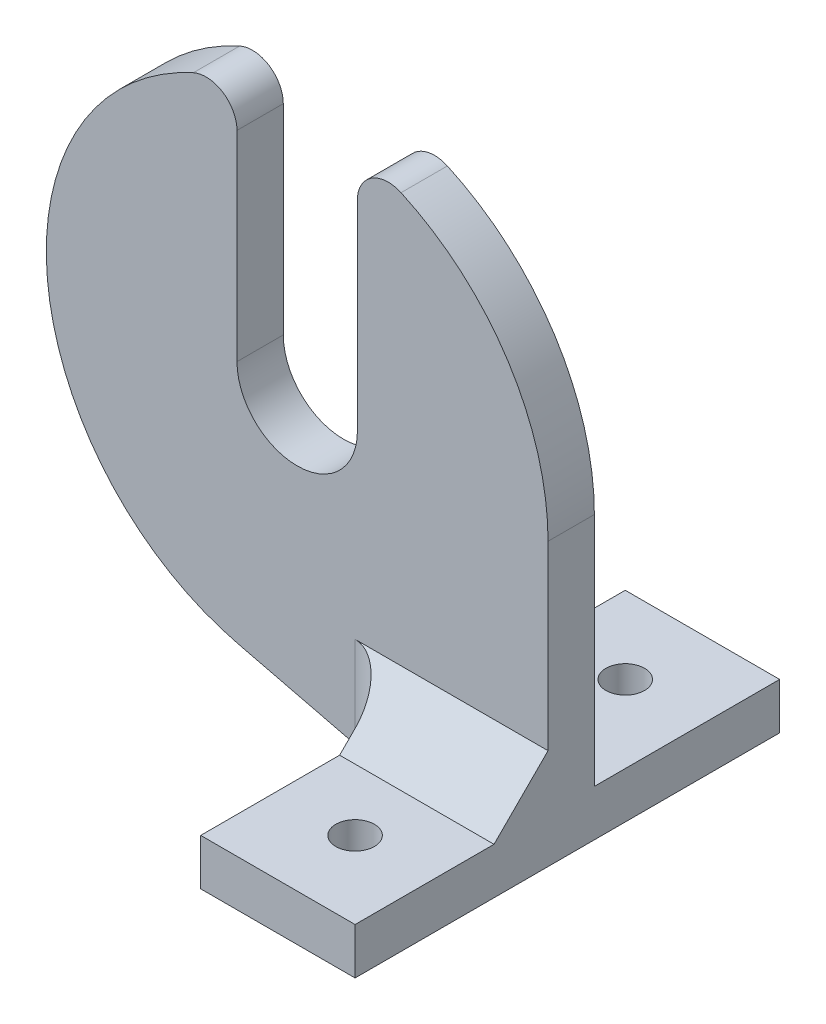
ISO-10303-21;
HEADER;
FILE_DESCRIPTION(('STEP AP214'),'2;1');
FILE_NAME('part.step','',(''),(''),'','','');
FILE_SCHEMA(('AUTOMOTIVE_DESIGN { 1 0 10303 214 1 1 1 1 }'));
ENDSEC;
DATA;
#1=APPLICATION_CONTEXT('core data for automotive mechanical design processes');
#2=APPLICATION_PROTOCOL_DEFINITION('international standard','automotive_design',2000,#1);
#3=PRODUCT_CONTEXT('',#1,'mechanical');
#4=PRODUCT('Part','Part','',(#3));
#5=PRODUCT_RELATED_PRODUCT_CATEGORY('part','',(#4));
#6=PRODUCT_DEFINITION_FORMATION('','',#4);
#7=PRODUCT_DEFINITION_CONTEXT('part definition',#1,'design');
#8=PRODUCT_DEFINITION('design','',#6,#7);
#9=PRODUCT_DEFINITION_SHAPE('','',#8);
#10=(LENGTH_UNIT() NAMED_UNIT(*) SI_UNIT(.MILLI.,.METRE.));
#11=(NAMED_UNIT(*) PLANE_ANGLE_UNIT() SI_UNIT($,.RADIAN.));
#12=(NAMED_UNIT(*) SI_UNIT($,.STERADIAN.) SOLID_ANGLE_UNIT());
#13=UNCERTAINTY_MEASURE_WITH_UNIT(LENGTH_MEASURE(1.E-05),#10,'distance_accuracy_value','');
#14=(GEOMETRIC_REPRESENTATION_CONTEXT(3) GLOBAL_UNCERTAINTY_ASSIGNED_CONTEXT((#13)) GLOBAL_UNIT_ASSIGNED_CONTEXT((#10,
#11,#12)) REPRESENTATION_CONTEXT('',''));
#15=CARTESIAN_POINT('',(0.,0.,0.));
#16=DIRECTION('',(0.,0.,1.));
#17=DIRECTION('',(1.,0.,0.));
#18=AXIS2_PLACEMENT_3D('',#15,#16,#17);
#19=CARTESIAN_POINT('',(0.,0.,7.62));
#20=DIRECTION('',(0.,0.,-1.));
#21=DIRECTION('',(-1.,0.,0.));
#22=AXIS2_PLACEMENT_3D('',#19,#20,#21);
#23=CYLINDRICAL_SURFACE('',#22,41.275);
#24=CARTESIAN_POINT('',(0.,0.,7.62));
#25=DIRECTION('',(0.,0.,1.));
#26=DIRECTION('',(1.,0.,0.));
#27=AXIS2_PLACEMENT_3D('',#24,#25,#26);
#28=CIRCLE('',#27,41.275);
#29=CARTESIAN_POINT('',(-17.089298245614,37.571019555935,7.62));
#30=VERTEX_POINT('',#29);
#31=CARTESIAN_POINT('',(-9.77755074004489,-40.1001886096044,7.62));
#32=VERTEX_POINT('',#31);
#33=EDGE_CURVE('E242',#30,#32,#28,.T.);
#34=ORIENTED_EDGE('',*,*,#33,.F.);
#35=DIRECTION('',(0.,0.,-1.));
#36=VECTOR('',#35,1.);
#37=CARTESIAN_POINT('',(-17.089298245614,37.571019555935,7.62));
#38=LINE('',#37,#36);
#39=CARTESIAN_POINT('',(-17.089298245614,37.571019555935,0.));
#40=VERTEX_POINT('',#39);
#41=EDGE_CURVE('E48',#30,#40,#38,.T.);
#42=ORIENTED_EDGE('',*,*,#41,.T.);
#43=CARTESIAN_POINT('',(0.,0.,0.));
#44=DIRECTION('',(0.,0.,1.));
#45=DIRECTION('',(1.,0.,0.));
#46=AXIS2_PLACEMENT_3D('',#43,#44,#45);
#47=CIRCLE('',#46,41.275);
#48=CARTESIAN_POINT('',(-9.77755074004489,-40.1001886096044,0.));
#49=VERTEX_POINT('',#48);
#50=EDGE_CURVE('E262',#40,#49,#47,.T.);
#51=ORIENTED_EDGE('',*,*,#50,.T.);
#52=DIRECTION('',(0.,0.,1.));
#53=VECTOR('',#52,1.);
#54=CARTESIAN_POINT('',(-9.7775507400449,-40.1001886096044,0.));
#55=LINE('',#54,#53);
#56=EDGE_CURVE('E196',#49,#32,#55,.T.);
#57=ORIENTED_EDGE('',*,*,#56,.T.);
#58=EDGE_LOOP('',(#34,#42,#51,#57));
#59=FACE_BOUND('',#58,.T.);
#60=ADVANCED_FACE('F39',(#59),#23,.T.);
#61=CARTESIAN_POINT('',(15.875,-38.735,-30.48));
#62=DIRECTION('',(-1.,0.,0.));
#63=DIRECTION('',(0.,0.,1.));
#64=AXIS2_PLACEMENT_3D('',#61,#62,#63);
#65=PLANE('',#64);
#66=DIRECTION('',(0.,0.,1.));
#67=VECTOR('',#66,1.);
#68=CARTESIAN_POINT('',(15.875,-46.355,-30.48));
#69=LINE('',#68,#67);
#70=CARTESIAN_POINT('',(15.875,-46.355,-30.48));
#71=VERTEX_POINT('',#70);
#72=CARTESIAN_POINT('',(15.875,-46.355,-6.35));
#73=VERTEX_POINT('',#72);
#74=EDGE_CURVE('E223',#71,#73,#69,.T.);
#75=ORIENTED_EDGE('',*,*,#74,.T.);
#76=DIRECTION('',(0.,1.,0.));
#77=VECTOR('',#76,1.);
#78=CARTESIAN_POINT('',(15.875,-38.735,-6.35));
#79=LINE('',#78,#77);
#80=CARTESIAN_POINT('',(15.875,-38.735,-6.35));
#81=VERTEX_POINT('',#80);
#82=EDGE_CURVE('E310',#73,#81,#79,.T.);
#83=ORIENTED_EDGE('',*,*,#82,.T.);
#84=DIRECTION('',(0.,0.,1.));
#85=VECTOR('',#84,1.);
#86=CARTESIAN_POINT('',(15.875,-38.735,-30.48));
#87=LINE('',#86,#85);
#88=CARTESIAN_POINT('',(15.875,-38.735,-30.48));
#89=VERTEX_POINT('',#88);
#90=EDGE_CURVE('E228',#89,#81,#87,.T.);
#91=ORIENTED_EDGE('',*,*,#90,.F.);
#92=DIRECTION('',(0.,-1.,0.));
#93=VECTOR('',#92,1.);
#94=CARTESIAN_POINT('',(15.875,-38.735,-30.48));
#95=LINE('',#94,#93);
#96=EDGE_CURVE('E212',#89,#71,#95,.T.);
#97=ORIENTED_EDGE('',*,*,#96,.T.);
#98=EDGE_LOOP('',(#75,#83,#91,#97));
#99=FACE_BOUND('',#98,.T.);
#100=ADVANCED_FACE('F412',(#99),#65,.T.);
#101=CARTESIAN_POINT('',(0.,0.,7.62));
#102=DIRECTION('',(0.,0.,-1.));
#103=DIRECTION('',(-1.,0.,0.));
#104=AXIS2_PLACEMENT_3D('',#101,#102,#103);
#105=CYLINDRICAL_SURFACE('',#104,9.906);
#106=CARTESIAN_POINT('',(0.,0.,0.));
#107=DIRECTION('',(0.,0.,-1.));
#108=DIRECTION('',(-1.,0.,0.));
#109=AXIS2_PLACEMENT_3D('',#106,#107,#108);
#110=CIRCLE('',#109,9.906);
#111=CARTESIAN_POINT('',(9.906,0.,0.));
#112=VERTEX_POINT('',#111);
#113=CARTESIAN_POINT('',(-9.906,0.,0.));
#114=VERTEX_POINT('',#113);
#115=EDGE_CURVE('E222',#112,#114,#110,.T.);
#116=ORIENTED_EDGE('',*,*,#115,.T.);
#117=DIRECTION('',(0.,0.,-1.));
#118=VECTOR('',#117,1.);
#119=CARTESIAN_POINT('',(-9.906,0.,7.62));
#120=LINE('',#119,#118);
#121=CARTESIAN_POINT('',(-9.906,0.,7.62));
#122=VERTEX_POINT('',#121);
#123=EDGE_CURVE('E281',#122,#114,#120,.T.);
#124=ORIENTED_EDGE('',*,*,#123,.F.);
#125=CARTESIAN_POINT('',(0.,0.,7.62));
#126=DIRECTION('',(0.,0.,-1.));
#127=DIRECTION('',(-1.,0.,0.));
#128=AXIS2_PLACEMENT_3D('',#125,#126,#127);
#129=CIRCLE('',#128,9.906);
#130=CARTESIAN_POINT('',(9.906,0.,7.62));
#131=VERTEX_POINT('',#130);
#132=EDGE_CURVE('E234',#131,#122,#129,.T.);
#133=ORIENTED_EDGE('',*,*,#132,.F.);
#134=DIRECTION('',(0.,0.,-1.));
#135=VECTOR('',#134,1.);
#136=CARTESIAN_POINT('',(9.906,0.,7.62));
#137=LINE('',#136,#135);
#138=EDGE_CURVE('E255',#131,#112,#137,.T.);
#139=ORIENTED_EDGE('',*,*,#138,.T.);
#140=EDGE_LOOP('',(#116,#124,#133,#139));
#141=FACE_BOUND('',#140,.T.);
#142=ADVANCED_FACE('F422',(#141),#105,.F.);
#143=CARTESIAN_POINT('',(-9.906,0.,7.62));
#144=DIRECTION('',(-1.,0.,0.));
#145=DIRECTION('',(0.,0.,1.));
#146=AXIS2_PLACEMENT_3D('',#143,#144,#145);
#147=PLANE('',#146);
#148=DIRECTION('',(0.,1.,0.));
#149=VECTOR('',#148,1.);
#150=CARTESIAN_POINT('',(-9.906,0.,0.));
#151=LINE('',#150,#149);
#152=CARTESIAN_POINT('',(-9.906,32.9468940721276,0.));
#153=VERTEX_POINT('',#152);
#154=EDGE_CURVE('E259',#114,#153,#151,.T.);
#155=ORIENTED_EDGE('',*,*,#154,.T.);
#156=DIRECTION('',(0.,0.,-1.));
#157=VECTOR('',#156,1.);
#158=CARTESIAN_POINT('',(-9.906,32.9468940721276,7.62));
#159=LINE('',#158,#157);
#160=CARTESIAN_POINT('',(-9.906,32.9468940721276,7.62));
#161=VERTEX_POINT('',#160);
#162=EDGE_CURVE('E11',#153,#161,#159,.F.);
#163=ORIENTED_EDGE('',*,*,#162,.T.);
#164=DIRECTION('',(0.,1.,0.));
#165=VECTOR('',#164,1.);
#166=CARTESIAN_POINT('',(-9.906,0.,7.62));
#167=LINE('',#166,#165);
#168=EDGE_CURVE('E238',#122,#161,#167,.T.);
#169=ORIENTED_EDGE('',*,*,#168,.F.);
#170=ORIENTED_EDGE('',*,*,#123,.T.);
#171=EDGE_LOOP('',(#155,#163,#169,#170));
#172=FACE_BOUND('',#171,.T.);
#173=ADVANCED_FACE('F427',(#172),#147,.F.);
#174=CARTESIAN_POINT('',(41.275,0.,7.62));
#175=DIRECTION('',(-1.,0.,0.));
#176=DIRECTION('',(0.,-1.,0.));
#177=AXIS2_PLACEMENT_3D('',#174,#175,#176);
#178=PLANE('',#177);
#179=DIRECTION('',(0.,1.,0.));
#180=VECTOR('',#179,1.);
#181=CARTESIAN_POINT('',(41.275,0.,7.62));
#182=LINE('',#181,#180);
#183=CARTESIAN_POINT('',(41.275,-29.8449999999999,7.62));
#184=VERTEX_POINT('',#183);
#185=CARTESIAN_POINT('',(41.275,0.,7.62));
#186=VERTEX_POINT('',#185);
#187=EDGE_CURVE('E245',#184,#186,#182,.T.);
#188=ORIENTED_EDGE('',*,*,#187,.F.);
#189=DIRECTION('',(0.,-0.707106781186551,0.707106781186544));
#190=VECTOR('',#189,1.);
#191=CARTESIAN_POINT('',(41.275,-14.9224999999998,-7.30249999999997));
#192=LINE('',#191,#190);
#193=CARTESIAN_POINT('',(41.275,-38.735,16.51));
#194=VERTEX_POINT('',#193);
#195=EDGE_CURVE('E170',#184,#194,#192,.T.);
#196=ORIENTED_EDGE('',*,*,#195,.T.);
#197=DIRECTION('',(0.,0.,1.));
#198=VECTOR('',#197,1.);
#199=CARTESIAN_POINT('',(41.275,-38.735,-30.48));
#200=LINE('',#199,#198);
#201=CARTESIAN_POINT('',(41.275,-38.735,39.37));
#202=VERTEX_POINT('',#201);
#203=EDGE_CURVE('E164',#194,#202,#200,.T.);
#204=ORIENTED_EDGE('',*,*,#203,.T.);
#205=DIRECTION('',(0.,1.,0.));
#206=VECTOR('',#205,1.);
#207=CARTESIAN_POINT('',(41.275,-38.735,39.37));
#208=LINE('',#207,#206);
#209=CARTESIAN_POINT('',(41.275,-46.355,39.37));
#210=VERTEX_POINT('',#209);
#211=EDGE_CURVE('E169',#210,#202,#208,.T.);
#212=ORIENTED_EDGE('',*,*,#211,.F.);
#213=DIRECTION('',(0.,0.,1.));
#214=VECTOR('',#213,1.);
#215=CARTESIAN_POINT('',(41.275,-46.355,-30.48));
#216=LINE('',#215,#214);
#217=CARTESIAN_POINT('',(41.275,-46.355,-30.48));
#218=VERTEX_POINT('',#217);
#219=EDGE_CURVE('E219',#218,#210,#216,.T.);
#220=ORIENTED_EDGE('',*,*,#219,.F.);
#221=DIRECTION('',(0.,1.,0.));
#222=VECTOR('',#221,1.);
#223=CARTESIAN_POINT('',(41.275,-38.735,-30.48));
#224=LINE('',#223,#222);
#225=CARTESIAN_POINT('',(41.275,-38.735,-30.48));
#226=VERTEX_POINT('',#225);
#227=EDGE_CURVE('E204',#218,#226,#224,.T.);
#228=ORIENTED_EDGE('',*,*,#227,.T.);
#229=CARTESIAN_POINT('',(41.275,-38.735,0.));
#230=VERTEX_POINT('',#229);
#231=EDGE_CURVE('E174',#226,#230,#200,.T.);
#232=ORIENTED_EDGE('',*,*,#231,.T.);
#233=DIRECTION('',(0.,1.,0.));
#234=VECTOR('',#233,1.);
#235=CARTESIAN_POINT('',(41.275,0.,0.));
#236=LINE('',#235,#234);
#237=CARTESIAN_POINT('',(41.275,0.,0.));
#238=VERTEX_POINT('',#237);
#239=EDGE_CURVE('E265',#230,#238,#236,.T.);
#240=ORIENTED_EDGE('',*,*,#239,.T.);
#241=DIRECTION('',(0.,0.,-1.));
#242=VECTOR('',#241,1.);
#243=CARTESIAN_POINT('',(41.275,0.,7.62));
#244=LINE('',#243,#242);
#245=EDGE_CURVE('E277',#186,#238,#244,.T.);
#246=ORIENTED_EDGE('',*,*,#245,.F.);
#247=EDGE_LOOP('',(#188,#196,#204,#212,#220,#228,#232,#240,#246));
#248=FACE_BOUND('',#247,.T.);
#249=ADVANCED_FACE('F167',(#248),#178,.F.);
#250=CARTESIAN_POINT('',(0.,0.,7.62));
#251=DIRECTION('',(0.,0.,-1.));
#252=DIRECTION('',(-1.,0.,0.));
#253=AXIS2_PLACEMENT_3D('',#250,#251,#252);
#254=CYLINDRICAL_SURFACE('',#253,41.275);
#255=CARTESIAN_POINT('',(0.,0.,0.));
#256=DIRECTION('',(0.,0.,1.));
#257=DIRECTION('',(1.,0.,0.));
#258=AXIS2_PLACEMENT_3D('',#255,#256,#257);
#259=CIRCLE('',#258,41.275);
#260=CARTESIAN_POINT('',(17.089298245614,37.571019555935,0.));
#261=VERTEX_POINT('',#260);
#262=EDGE_CURVE('E268',#238,#261,#259,.T.);
#263=ORIENTED_EDGE('',*,*,#262,.T.);
#264=DIRECTION('',(0.,0.,-1.));
#265=VECTOR('',#264,1.);
#266=CARTESIAN_POINT('',(17.089298245614,37.571019555935,7.62));
#267=LINE('',#266,#265);
#268=CARTESIAN_POINT('',(17.089298245614,37.571019555935,7.62));
#269=VERTEX_POINT('',#268);
#270=EDGE_CURVE('E341',#261,#269,#267,.F.);
#271=ORIENTED_EDGE('',*,*,#270,.T.);
#272=CARTESIAN_POINT('',(0.,0.,7.62));
#273=DIRECTION('',(0.,0.,1.));
#274=DIRECTION('',(1.,0.,0.));
#275=AXIS2_PLACEMENT_3D('',#272,#273,#274);
#276=CIRCLE('',#275,41.275);
#277=EDGE_CURVE('E248',#186,#269,#276,.T.);
#278=ORIENTED_EDGE('',*,*,#277,.F.);
#279=ORIENTED_EDGE('',*,*,#245,.T.);
#280=EDGE_LOOP('',(#263,#271,#278,#279));
#281=FACE_BOUND('',#280,.T.);
#282=ADVANCED_FACE('F463',(#281),#254,.T.);
#283=CARTESIAN_POINT('',(9.906,0.,7.62));
#284=DIRECTION('',(1.,0.,0.));
#285=DIRECTION('',(0.,0.,-1.));
#286=AXIS2_PLACEMENT_3D('',#283,#284,#285);
#287=PLANE('',#286);
#288=DIRECTION('',(0.,-1.,0.));
#289=VECTOR('',#288,1.);
#290=CARTESIAN_POINT('',(9.906,0.,7.62));
#291=LINE('',#290,#289);
#292=CARTESIAN_POINT('',(9.906,32.9468940721276,7.62));
#293=VERTEX_POINT('',#292);
#294=EDGE_CURVE('E252',#293,#131,#291,.T.);
#295=ORIENTED_EDGE('',*,*,#294,.F.);
#296=DIRECTION('',(0.,0.,-1.));
#297=VECTOR('',#296,1.);
#298=CARTESIAN_POINT('',(9.906,32.9468940721276,7.62));
#299=LINE('',#298,#297);
#300=CARTESIAN_POINT('',(9.906,32.9468940721276,0.));
#301=VERTEX_POINT('',#300);
#302=EDGE_CURVE('E331',#293,#301,#299,.T.);
#303=ORIENTED_EDGE('',*,*,#302,.T.);
#304=DIRECTION('',(0.,-1.,0.));
#305=VECTOR('',#304,1.);
#306=CARTESIAN_POINT('',(9.906,0.,0.));
#307=LINE('',#306,#305);
#308=EDGE_CURVE('E239',#301,#112,#307,.T.);
#309=ORIENTED_EDGE('',*,*,#308,.T.);
#310=ORIENTED_EDGE('',*,*,#138,.F.);
#311=EDGE_LOOP('',(#295,#303,#309,#310));
#312=FACE_BOUND('',#311,.T.);
#313=ADVANCED_FACE('F457',(#312),#287,.F.);
#314=CARTESIAN_POINT('',(0.,0.,7.62));
#315=DIRECTION('',(0.,0.,-1.));
#316=DIRECTION('',(-1.,0.,0.));
#317=AXIS2_PLACEMENT_3D('',#314,#315,#316);
#318=PLANE('',#317);
#319=ORIENTED_EDGE('',*,*,#277,.T.);
#320=CARTESIAN_POINT('',(14.986,32.9468940721276,7.62));
#321=DIRECTION('',(0.,0.,-1.));
#322=DIRECTION('',(-1.,0.,0.));
#323=AXIS2_PLACEMENT_3D('',#320,#321,#322);
#324=CIRCLE('',#323,5.08);
#325=EDGE_CURVE('E346',#269,#293,#324,.F.);
#326=ORIENTED_EDGE('',*,*,#325,.T.);
#327=ORIENTED_EDGE('',*,*,#294,.T.);
#328=ORIENTED_EDGE('',*,*,#132,.T.);
#329=ORIENTED_EDGE('',*,*,#168,.T.);
#330=CARTESIAN_POINT('',(-14.986,32.9468940721276,7.62));
#331=DIRECTION('',(0.,0.,-1.));
#332=DIRECTION('',(-1.,0.,0.));
#333=AXIS2_PLACEMENT_3D('',#330,#331,#332);
#334=CIRCLE('',#333,5.08);
#335=EDGE_CURVE('E55',#161,#30,#334,.F.);
#336=ORIENTED_EDGE('',*,*,#335,.T.);
#337=ORIENTED_EDGE('',*,*,#33,.T.);
#338=DIRECTION('',(0.971536974187872,-0.236887964628585,0.));
#339=VECTOR('',#338,1.);
#340=CARTESIAN_POINT('',(15.875,-46.355,7.62));
#341=LINE('',#340,#339);
#342=CARTESIAN_POINT('',(9.52500000000001,-44.806691890935,7.62));
#343=VERTEX_POINT('',#342);
#344=EDGE_CURVE('E366',#32,#343,#341,.T.);
#345=ORIENTED_EDGE('',*,*,#344,.T.);
#346=DIRECTION('',(0.,1.,0.));
#347=VECTOR('',#346,1.);
#348=CARTESIAN_POINT('',(9.52500000000001,0.,7.62));
#349=LINE('',#348,#347);
#350=CARTESIAN_POINT('',(9.52500000000001,-29.8449999999999,7.62));
#351=VERTEX_POINT('',#350);
#352=EDGE_CURVE('E302',#343,#351,#349,.T.);
#353=ORIENTED_EDGE('',*,*,#352,.T.);
#354=DIRECTION('',(1.,0.,0.));
#355=VECTOR('',#354,1.);
#356=CARTESIAN_POINT('',(0.,-29.8449999999999,7.62));
#357=LINE('',#356,#355);
#358=EDGE_CURVE('E289',#351,#184,#357,.T.);
#359=ORIENTED_EDGE('',*,*,#358,.T.);
#360=ORIENTED_EDGE('',*,*,#187,.T.);
#361=EDGE_LOOP('',(#319,#326,#327,#328,#329,#336,#337,#345,#353,#359,#360));
#362=FACE_BOUND('',#361,.T.);
#363=ADVANCED_FACE('F453',(#362),#318,.F.);
#364=CARTESIAN_POINT('',(0.,0.,0.));
#365=DIRECTION('',(0.,0.,-1.));
#366=DIRECTION('',(-1.,0.,0.));
#367=AXIS2_PLACEMENT_3D('',#364,#365,#366);
#368=PLANE('',#367);
#369=ORIENTED_EDGE('',*,*,#308,.F.);
#370=CARTESIAN_POINT('',(14.986,32.9468940721276,0.));
#371=DIRECTION('',(0.,0.,-1.));
#372=DIRECTION('',(-1.,0.,0.));
#373=AXIS2_PLACEMENT_3D('',#370,#371,#372);
#374=CIRCLE('',#373,5.08);
#375=EDGE_CURVE('E338',#301,#261,#374,.T.);
#376=ORIENTED_EDGE('',*,*,#375,.T.);
#377=ORIENTED_EDGE('',*,*,#262,.F.);
#378=ORIENTED_EDGE('',*,*,#239,.F.);
#379=DIRECTION('',(1.,0.,0.));
#380=VECTOR('',#379,1.);
#381=CARTESIAN_POINT('',(0.,-38.735,0.));
#382=LINE('',#381,#380);
#383=CARTESIAN_POINT('',(9.52500000000001,-38.735,0.));
#384=VERTEX_POINT('',#383);
#385=EDGE_CURVE('E285',#384,#230,#382,.T.);
#386=ORIENTED_EDGE('',*,*,#385,.F.);
#387=DIRECTION('',(0.,1.,0.));
#388=VECTOR('',#387,1.);
#389=CARTESIAN_POINT('',(9.52500000000001,-46.355,0.));
#390=LINE('',#389,#388);
#391=CARTESIAN_POINT('',(9.52500000000001,-44.806691890935,0.));
#392=VERTEX_POINT('',#391);
#393=EDGE_CURVE('E314',#384,#392,#390,.F.);
#394=ORIENTED_EDGE('',*,*,#393,.T.);
#395=DIRECTION('',(0.971536974187872,-0.236887964628585,0.));
#396=VECTOR('',#395,1.);
#397=CARTESIAN_POINT('',(15.875,-46.355,0.));
#398=LINE('',#397,#396);
#399=EDGE_CURVE('E361',#49,#392,#398,.T.);
#400=ORIENTED_EDGE('',*,*,#399,.F.);
#401=ORIENTED_EDGE('',*,*,#50,.F.);
#402=CARTESIAN_POINT('',(-14.986,32.9468940721276,0.));
#403=DIRECTION('',(0.,0.,-1.));
#404=DIRECTION('',(-1.,0.,0.));
#405=AXIS2_PLACEMENT_3D('',#402,#403,#404);
#406=CIRCLE('',#405,5.08);
#407=EDGE_CURVE('E335',#40,#153,#406,.T.);
#408=ORIENTED_EDGE('',*,*,#407,.T.);
#409=ORIENTED_EDGE('',*,*,#154,.F.);
#410=ORIENTED_EDGE('',*,*,#115,.F.);
#411=EDGE_LOOP('',(#369,#376,#377,#378,#386,#394,#400,#401,#408,#409,#410));
#412=FACE_BOUND('',#411,.T.);
#413=ADVANCED_FACE('F359',(#412),#368,.T.);
#414=DIRECTION('',(0.,0.707106781186551,-0.707106781186544));
#415=VECTOR('',#414,1.);
#416=CARTESIAN_POINT('',(15.875,-29.8449999999999,7.62));
#417=LINE('',#416,#415);
#418=CARTESIAN_POINT('',(15.875,-38.735,16.51));
#419=VERTEX_POINT('',#418);
#420=CARTESIAN_POINT('',(15.875,-36.195,13.97));
#421=VERTEX_POINT('',#420);
#422=EDGE_CURVE('E298',#419,#421,#417,.T.);
#423=ORIENTED_EDGE('',*,*,#422,.T.);
#424=DIRECTION('',(0.,1.,0.));
#425=VECTOR('',#424,1.);
#426=CARTESIAN_POINT('',(15.875,-38.735,13.97));
#427=LINE('',#426,#425);
#428=CARTESIAN_POINT('',(15.875,-46.355,13.97));
#429=VERTEX_POINT('',#428);
#430=EDGE_CURVE('E306',#421,#429,#427,.F.);
#431=ORIENTED_EDGE('',*,*,#430,.T.);
#432=CARTESIAN_POINT('',(15.875,-46.355,39.37));
#433=VERTEX_POINT('',#432);
#434=EDGE_CURVE('E227',#429,#433,#69,.T.);
#435=ORIENTED_EDGE('',*,*,#434,.T.);
#436=DIRECTION('',(0.,-1.,0.));
#437=VECTOR('',#436,1.);
#438=CARTESIAN_POINT('',(15.875,-38.735,39.37));
#439=LINE('',#438,#437);
#440=CARTESIAN_POINT('',(15.875,-38.735,39.37));
#441=VERTEX_POINT('',#440);
#442=EDGE_CURVE('E186',#441,#433,#439,.T.);
#443=ORIENTED_EDGE('',*,*,#442,.F.);
#444=EDGE_CURVE('E181',#419,#441,#87,.T.);
#445=ORIENTED_EDGE('',*,*,#444,.F.);
#446=EDGE_LOOP('',(#423,#431,#435,#443,#445));
#447=FACE_BOUND('',#446,.T.);
#448=ADVANCED_FACE('F402',(#447),#65,.T.);
#449=CARTESIAN_POINT('',(41.275,-38.735,-30.48));
#450=DIRECTION('',(0.,1.,0.));
#451=DIRECTION('',(0.,0.,1.));
#452=AXIS2_PLACEMENT_3D('',#449,#450,#451);
#453=PLANE('',#452);
#454=CARTESIAN_POINT('',(28.575,-38.735,26.67));
#455=DIRECTION('',(0.,1.,0.));
#456=DIRECTION('',(0.,0.,1.));
#457=AXIS2_PLACEMENT_3D('',#454,#455,#456);
#458=CIRCLE('',#457,3.175);
#459=CARTESIAN_POINT('',(28.575,-38.735,29.845));
#460=VERTEX_POINT('',#459);
#461=EDGE_CURVE('E382',#460,#460,#458,.T.);
#462=ORIENTED_EDGE('',*,*,#461,.F.);
#463=EDGE_LOOP('',(#462));
#464=FACE_BOUND('',#463,.T.);
#465=ORIENTED_EDGE('',*,*,#203,.F.);
#466=DIRECTION('',(-1.,0.,0.));
#467=VECTOR('',#466,1.);
#468=CARTESIAN_POINT('',(41.275,-38.735,16.51));
#469=LINE('',#468,#467);
#470=EDGE_CURVE('E293',#194,#419,#469,.T.);
#471=ORIENTED_EDGE('',*,*,#470,.T.);
#472=ORIENTED_EDGE('',*,*,#444,.T.);
#473=DIRECTION('',(-1.,0.,0.));
#474=VECTOR('',#473,1.);
#475=CARTESIAN_POINT('',(41.275,-38.735,39.37));
#476=LINE('',#475,#474);
#477=EDGE_CURVE('E178',#202,#441,#476,.T.);
#478=ORIENTED_EDGE('',*,*,#477,.F.);
#479=EDGE_LOOP('',(#465,#471,#472,#478));
#480=FACE_BOUND('',#479,.T.);
#481=ADVANCED_FACE('F179',(#464,#480),#453,.T.);
#482=CARTESIAN_POINT('',(41.275,-46.355,-30.48));
#483=DIRECTION('',(0.,-1.,0.));
#484=DIRECTION('',(0.,0.,-1.));
#485=AXIS2_PLACEMENT_3D('',#482,#483,#484);
#486=PLANE('',#485);
#487=CARTESIAN_POINT('',(28.575,-46.355,26.67));
#488=DIRECTION('',(0.,1.,0.));
#489=DIRECTION('',(0.,0.,1.));
#490=AXIS2_PLACEMENT_3D('',#487,#488,#489);
#491=CIRCLE('',#490,3.175);
#492=CARTESIAN_POINT('',(28.575,-46.355,29.845));
#493=VERTEX_POINT('',#492);
#494=EDGE_CURVE('E371',#493,#493,#491,.T.);
#495=ORIENTED_EDGE('',*,*,#494,.T.);
#496=EDGE_LOOP('',(#495));
#497=FACE_BOUND('',#496,.T.);
#498=CARTESIAN_POINT('',(28.575,-46.355,-17.78));
#499=DIRECTION('',(0.,1.,0.));
#500=DIRECTION('',(0.,0.,1.));
#501=AXIS2_PLACEMENT_3D('',#498,#499,#500);
#502=CIRCLE('',#501,3.175);
#503=CARTESIAN_POINT('',(28.575,-46.355,-14.605));
#504=VERTEX_POINT('',#503);
#505=EDGE_CURVE('E378',#504,#504,#502,.T.);
#506=ORIENTED_EDGE('',*,*,#505,.T.);
#507=EDGE_LOOP('',(#506));
#508=FACE_BOUND('',#507,.T.);
#509=ORIENTED_EDGE('',*,*,#219,.T.);
#510=DIRECTION('',(1.,0.,0.));
#511=VECTOR('',#510,1.);
#512=CARTESIAN_POINT('',(41.275,-46.355,39.37));
#513=LINE('',#512,#511);
#514=EDGE_CURVE('E191',#433,#210,#513,.T.);
#515=ORIENTED_EDGE('',*,*,#514,.F.);
#516=ORIENTED_EDGE('',*,*,#434,.F.);
#517=DIRECTION('',(0.,0.,1.));
#518=VECTOR('',#517,1.);
#519=CARTESIAN_POINT('',(15.875,-46.355,0.));
#520=LINE('',#519,#518);
#521=EDGE_CURVE('E193',#73,#429,#520,.T.);
#522=ORIENTED_EDGE('',*,*,#521,.F.);
#523=ORIENTED_EDGE('',*,*,#74,.F.);
#524=DIRECTION('',(1.,0.,0.));
#525=VECTOR('',#524,1.);
#526=CARTESIAN_POINT('',(41.275,-46.355,-30.48));
#527=LINE('',#526,#525);
#528=EDGE_CURVE('E175',#71,#218,#527,.T.);
#529=ORIENTED_EDGE('',*,*,#528,.T.);
#530=EDGE_LOOP('',(#509,#515,#516,#522,#523,#529));
#531=FACE_BOUND('',#530,.T.);
#532=ADVANCED_FACE('F390',(#497,#508,#531),#486,.T.);
#533=CARTESIAN_POINT('',(28.575,-38.735,-17.78));
#534=DIRECTION('',(0.,1.,0.));
#535=DIRECTION('',(0.,0.,1.));
#536=AXIS2_PLACEMENT_3D('',#533,#534,#535);
#537=CIRCLE('',#536,3.175);
#538=CARTESIAN_POINT('',(28.575,-38.735,-14.605));
#539=VERTEX_POINT('',#538);
#540=EDGE_CURVE('E374',#539,#539,#537,.T.);
#541=ORIENTED_EDGE('',*,*,#540,.F.);
#542=EDGE_LOOP('',(#541));
#543=FACE_BOUND('',#542,.T.);
#544=ORIENTED_EDGE('',*,*,#90,.T.);
#545=CARTESIAN_POINT('',(9.52500000000001,-38.735,-6.35));
#546=DIRECTION('',(0.,1.,0.));
#547=DIRECTION('',(0.,0.,1.));
#548=AXIS2_PLACEMENT_3D('',#545,#546,#547);
#549=CIRCLE('',#548,6.35);
#550=EDGE_CURVE('E323',#81,#384,#549,.F.);
#551=ORIENTED_EDGE('',*,*,#550,.T.);
#552=ORIENTED_EDGE('',*,*,#385,.T.);
#553=ORIENTED_EDGE('',*,*,#231,.F.);
#554=DIRECTION('',(-1.,0.,0.));
#555=VECTOR('',#554,1.);
#556=CARTESIAN_POINT('',(41.275,-38.735,-30.48));
#557=LINE('',#556,#555);
#558=EDGE_CURVE('E208',#226,#89,#557,.T.);
#559=ORIENTED_EDGE('',*,*,#558,.T.);
#560=EDGE_LOOP('',(#544,#551,#552,#553,#559));
#561=FACE_BOUND('',#560,.T.);
#562=ADVANCED_FACE('F404',(#543,#561),#453,.T.);
#563=CARTESIAN_POINT('',(0.,0.,-30.48));
#564=DIRECTION('',(0.,0.,-1.));
#565=DIRECTION('',(-1.,0.,0.));
#566=AXIS2_PLACEMENT_3D('',#563,#564,#565);
#567=PLANE('',#566);
#568=ORIENTED_EDGE('',*,*,#227,.F.);
#569=ORIENTED_EDGE('',*,*,#528,.F.);
#570=ORIENTED_EDGE('',*,*,#96,.F.);
#571=ORIENTED_EDGE('',*,*,#558,.F.);
#572=EDGE_LOOP('',(#568,#569,#570,#571));
#573=FACE_BOUND('',#572,.T.);
#574=ADVANCED_FACE('F415',(#573),#567,.T.);
#575=CARTESIAN_POINT('',(0.,0.,39.37));
#576=DIRECTION('',(0.,0.,-1.));
#577=DIRECTION('',(-1.,0.,0.));
#578=AXIS2_PLACEMENT_3D('',#575,#576,#577);
#579=PLANE('',#578);
#580=ORIENTED_EDGE('',*,*,#211,.T.);
#581=ORIENTED_EDGE('',*,*,#477,.T.);
#582=ORIENTED_EDGE('',*,*,#442,.T.);
#583=ORIENTED_EDGE('',*,*,#514,.T.);
#584=EDGE_LOOP('',(#580,#581,#582,#583));
#585=FACE_BOUND('',#584,.T.);
#586=ADVANCED_FACE('F189',(#585),#579,.F.);
#587=CARTESIAN_POINT('',(15.875,-46.355,0.));
#588=DIRECTION('',(-0.236887964628585,-0.971536974187872,0.));
#589=DIRECTION('',(0.971536974187872,-0.236887964628585,0.));
#590=AXIS2_PLACEMENT_3D('',#587,#588,#589);
#591=PLANE('',#590);
#592=ORIENTED_EDGE('',*,*,#344,.F.);
#593=ORIENTED_EDGE('',*,*,#56,.F.);
#594=ORIENTED_EDGE('',*,*,#399,.T.);
#595=CARTESIAN_POINT('',(9.52500000000001,-44.806691890935,-6.35));
#596=DIRECTION('',(-0.236887964628585,-0.971536974187872,0.));
#597=DIRECTION('',(0.971536974187872,-0.236887964628585,0.));
#598=AXIS2_PLACEMENT_3D('',#595,#596,#597);
#599=ELLIPSE('',#598,6.53603534266732,6.35);
#600=EDGE_CURVE('E327',#392,#73,#599,.F.);
#601=ORIENTED_EDGE('',*,*,#600,.T.);
#602=ORIENTED_EDGE('',*,*,#521,.T.);
#603=CARTESIAN_POINT('',(9.52500000000001,-44.806691890935,13.97));
#604=DIRECTION('',(-0.236887964628585,-0.971536974187872,0.));
#605=DIRECTION('',(-0.971536974187872,0.236887964628585,0.));
#606=AXIS2_PLACEMENT_3D('',#603,#604,#605);
#607=ELLIPSE('',#606,6.53603534266732,6.35);
#608=EDGE_CURVE('E320',#429,#343,#607,.F.);
#609=ORIENTED_EDGE('',*,*,#608,.T.);
#610=EDGE_LOOP('',(#592,#593,#594,#601,#602,#609));
#611=FACE_BOUND('',#610,.T.);
#612=ADVANCED_FACE('F469',(#611),#591,.T.);
#613=CARTESIAN_POINT('',(28.575,-46.355,-17.78));
#614=DIRECTION('',(0.,1.,0.));
#615=DIRECTION('',(0.,0.,1.));
#616=AXIS2_PLACEMENT_3D('',#613,#614,#615);
#617=CYLINDRICAL_SURFACE('',#616,3.175);
#618=CARTESIAN_POINT('',(28.575,-46.355,-14.605));
#619=CARTESIAN_POINT('',(28.575,-46.275625,-14.605));
#620=CARTESIAN_POINT('',(28.575,-46.19625,-14.605));
#621=CARTESIAN_POINT('',(28.575,-46.0375,-14.605));
#622=CARTESIAN_POINT('',(28.575,-45.958125,-14.605));
#623=CARTESIAN_POINT('',(28.575,-45.799375,-14.605));
#624=CARTESIAN_POINT('',(28.575,-45.72,-14.605));
#625=CARTESIAN_POINT('',(28.575,-45.56125,-14.605));
#626=CARTESIAN_POINT('',(28.575,-45.481875,-14.605));
#627=CARTESIAN_POINT('',(28.575,-45.323125,-14.605));
#628=CARTESIAN_POINT('',(28.575,-45.24375,-14.605));
#629=CARTESIAN_POINT('',(28.575,-45.085,-14.605));
#630=CARTESIAN_POINT('',(28.575,-45.005625,-14.605));
#631=CARTESIAN_POINT('',(28.575,-44.846875,-14.605));
#632=CARTESIAN_POINT('',(28.575,-44.7675,-14.605));
#633=CARTESIAN_POINT('',(28.575,-44.60875,-14.605));
#634=CARTESIAN_POINT('',(28.575,-44.529375,-14.605));
#635=CARTESIAN_POINT('',(28.575,-44.370625,-14.605));
#636=CARTESIAN_POINT('',(28.575,-44.29125,-14.605));
#637=CARTESIAN_POINT('',(28.575,-44.1325,-14.605));
#638=CARTESIAN_POINT('',(28.575,-44.053125,-14.605));
#639=CARTESIAN_POINT('',(28.575,-43.894375,-14.605));
#640=CARTESIAN_POINT('',(28.575,-43.815,-14.605));
#641=CARTESIAN_POINT('',(28.575,-43.65625,-14.605));
#642=CARTESIAN_POINT('',(28.575,-43.576875,-14.605));
#643=CARTESIAN_POINT('',(28.575,-43.418125,-14.605));
#644=CARTESIAN_POINT('',(28.575,-43.33875,-14.605));
#645=CARTESIAN_POINT('',(28.575,-43.18,-14.605));
#646=CARTESIAN_POINT('',(28.575,-43.100625,-14.605));
#647=CARTESIAN_POINT('',(28.575,-42.941875,-14.605));
#648=CARTESIAN_POINT('',(28.575,-42.8625,-14.605));
#649=CARTESIAN_POINT('',(28.575,-42.70375,-14.605));
#650=CARTESIAN_POINT('',(28.575,-42.624375,-14.605));
#651=CARTESIAN_POINT('',(28.575,-42.465625,-14.605));
#652=CARTESIAN_POINT('',(28.575,-42.38625,-14.605));
#653=CARTESIAN_POINT('',(28.575,-42.2275,-14.605));
#654=CARTESIAN_POINT('',(28.575,-42.148125,-14.605));
#655=CARTESIAN_POINT('',(28.575,-41.989375,-14.605));
#656=CARTESIAN_POINT('',(28.575,-41.91,-14.605));
#657=CARTESIAN_POINT('',(28.575,-41.75125,-14.605));
#658=CARTESIAN_POINT('',(28.575,-41.671875,-14.605));
#659=CARTESIAN_POINT('',(28.575,-41.513125,-14.605));
#660=CARTESIAN_POINT('',(28.575,-41.43375,-14.605));
#661=CARTESIAN_POINT('',(28.575,-41.275,-14.605));
#662=CARTESIAN_POINT('',(28.575,-41.195625,-14.605));
#663=CARTESIAN_POINT('',(28.575,-41.036875,-14.605));
#664=CARTESIAN_POINT('',(28.575,-40.9575,-14.605));
#665=CARTESIAN_POINT('',(28.575,-40.79875,-14.605));
#666=CARTESIAN_POINT('',(28.575,-40.719375,-14.605));
#667=CARTESIAN_POINT('',(28.575,-40.560625,-14.605));
#668=CARTESIAN_POINT('',(28.575,-40.48125,-14.605));
#669=CARTESIAN_POINT('',(28.575,-40.3225,-14.605));
#670=CARTESIAN_POINT('',(28.575,-40.243125,-14.605));
#671=CARTESIAN_POINT('',(28.575,-40.084375,-14.605));
#672=CARTESIAN_POINT('',(28.575,-40.005,-14.605));
#673=CARTESIAN_POINT('',(28.575,-39.84625,-14.605));
#674=CARTESIAN_POINT('',(28.575,-39.766875,-14.605));
#675=CARTESIAN_POINT('',(28.575,-39.608125,-14.605));
#676=CARTESIAN_POINT('',(28.575,-39.52875,-14.605));
#677=CARTESIAN_POINT('',(28.575,-39.37,-14.605));
#678=CARTESIAN_POINT('',(28.575,-39.290625,-14.605));
#679=CARTESIAN_POINT('',(28.575,-39.131875,-14.605));
#680=CARTESIAN_POINT('',(28.575,-39.0525,-14.605));
#681=CARTESIAN_POINT('',(28.575,-38.89375,-14.605));
#682=CARTESIAN_POINT('',(28.575,-38.814375,-14.605));
#683=CARTESIAN_POINT('',(28.575,-38.735,-14.605));
#684=B_SPLINE_CURVE_WITH_KNOTS('',3,(#618,#619,#620,#621,#622,#623,#624,#625,#626,#627,#628,
#629,#630,#631,#632,#633,#634,#635,#636,#637,#638,#639,#640,#641,#642,#643,#644,#645,#646,#647,
#648,#649,#650,#651,#652,#653,#654,#655,#656,#657,#658,#659,#660,#661,#662,#663,#664,#665,#666,
#667,#668,#669,#670,#671,#672,#673,#674,#675,#676,#677,#678,#679,#680,#681,#682,#683),
.UNSPECIFIED.,.F.,.F.,(4,2,2,2,2,2,2,2,2,2,2,2,2,2,2,2,2,2,2,2,2,2,2,2,2,2,2,2,2,2,2,2,4),(0.,
0.238124999999999,0.476249999999998,0.714374999999996,0.952499999999995,1.19062499999999,
1.42875,1.666875,1.905,2.143125,2.38124999999999,2.619375,2.8575,3.095625,3.33375,3.571875,3.81,
4.048125,4.28625,4.524375,4.7625,5.000625,5.23875,5.476875,5.715,5.953125,6.19125,6.429375,
6.6675,6.905625,7.14375,7.381875,7.62),.UNSPECIFIED.);
#685=EDGE_CURVE('BSEAM397',#504,#539,#684,.T.);
#686=ORIENTED_EDGE('',*,*,#505,.F.);
#687=ORIENTED_EDGE('',*,*,#540,.T.);
#688=ORIENTED_EDGE('',*,*,#685,.T.);
#689=ORIENTED_EDGE('',*,*,#685,.F.);
#690=EDGE_LOOP('',(#686,#688,#687,#689));
#691=FACE_BOUND('',#690,.T.);
#692=ADVANCED_FACE('F397',(#691),#617,.F.);
#693=CARTESIAN_POINT('',(28.575,-46.355,26.67));
#694=DIRECTION('',(0.,1.,0.));
#695=DIRECTION('',(0.,0.,1.));
#696=AXIS2_PLACEMENT_3D('',#693,#694,#695);
#697=CYLINDRICAL_SURFACE('',#696,3.175);
#698=CARTESIAN_POINT('',(28.575,-46.355,29.845));
#699=CARTESIAN_POINT('',(28.575,-46.275625,29.845));
#700=CARTESIAN_POINT('',(28.575,-46.19625,29.845));
#701=CARTESIAN_POINT('',(28.575,-46.0375,29.845));
#702=CARTESIAN_POINT('',(28.575,-45.958125,29.845));
#703=CARTESIAN_POINT('',(28.575,-45.799375,29.845));
#704=CARTESIAN_POINT('',(28.575,-45.72,29.845));
#705=CARTESIAN_POINT('',(28.575,-45.56125,29.845));
#706=CARTESIAN_POINT('',(28.575,-45.481875,29.845));
#707=CARTESIAN_POINT('',(28.575,-45.323125,29.845));
#708=CARTESIAN_POINT('',(28.575,-45.24375,29.845));
#709=CARTESIAN_POINT('',(28.575,-45.085,29.845));
#710=CARTESIAN_POINT('',(28.575,-45.005625,29.845));
#711=CARTESIAN_POINT('',(28.575,-44.846875,29.845));
#712=CARTESIAN_POINT('',(28.575,-44.7675,29.845));
#713=CARTESIAN_POINT('',(28.575,-44.60875,29.845));
#714=CARTESIAN_POINT('',(28.575,-44.529375,29.845));
#715=CARTESIAN_POINT('',(28.575,-44.370625,29.845));
#716=CARTESIAN_POINT('',(28.575,-44.29125,29.845));
#717=CARTESIAN_POINT('',(28.575,-44.1325,29.845));
#718=CARTESIAN_POINT('',(28.575,-44.053125,29.845));
#719=CARTESIAN_POINT('',(28.575,-43.894375,29.845));
#720=CARTESIAN_POINT('',(28.575,-43.815,29.845));
#721=CARTESIAN_POINT('',(28.575,-43.65625,29.845));
#722=CARTESIAN_POINT('',(28.575,-43.576875,29.845));
#723=CARTESIAN_POINT('',(28.575,-43.418125,29.845));
#724=CARTESIAN_POINT('',(28.575,-43.33875,29.845));
#725=CARTESIAN_POINT('',(28.575,-43.18,29.845));
#726=CARTESIAN_POINT('',(28.575,-43.100625,29.845));
#727=CARTESIAN_POINT('',(28.575,-42.941875,29.845));
#728=CARTESIAN_POINT('',(28.575,-42.8625,29.845));
#729=CARTESIAN_POINT('',(28.575,-42.70375,29.845));
#730=CARTESIAN_POINT('',(28.575,-42.624375,29.845));
#731=CARTESIAN_POINT('',(28.575,-42.465625,29.845));
#732=CARTESIAN_POINT('',(28.575,-42.38625,29.845));
#733=CARTESIAN_POINT('',(28.575,-42.2275,29.845));
#734=CARTESIAN_POINT('',(28.575,-42.148125,29.845));
#735=CARTESIAN_POINT('',(28.575,-41.989375,29.845));
#736=CARTESIAN_POINT('',(28.575,-41.91,29.845));
#737=CARTESIAN_POINT('',(28.575,-41.75125,29.845));
#738=CARTESIAN_POINT('',(28.575,-41.671875,29.845));
#739=CARTESIAN_POINT('',(28.575,-41.513125,29.845));
#740=CARTESIAN_POINT('',(28.575,-41.43375,29.845));
#741=CARTESIAN_POINT('',(28.575,-41.275,29.845));
#742=CARTESIAN_POINT('',(28.575,-41.195625,29.845));
#743=CARTESIAN_POINT('',(28.575,-41.036875,29.845));
#744=CARTESIAN_POINT('',(28.575,-40.9575,29.845));
#745=CARTESIAN_POINT('',(28.575,-40.79875,29.845));
#746=CARTESIAN_POINT('',(28.575,-40.719375,29.845));
#747=CARTESIAN_POINT('',(28.575,-40.560625,29.845));
#748=CARTESIAN_POINT('',(28.575,-40.48125,29.845));
#749=CARTESIAN_POINT('',(28.575,-40.3225,29.845));
#750=CARTESIAN_POINT('',(28.575,-40.243125,29.845));
#751=CARTESIAN_POINT('',(28.575,-40.084375,29.845));
#752=CARTESIAN_POINT('',(28.575,-40.005,29.845));
#753=CARTESIAN_POINT('',(28.575,-39.84625,29.845));
#754=CARTESIAN_POINT('',(28.575,-39.766875,29.845));
#755=CARTESIAN_POINT('',(28.575,-39.608125,29.845));
#756=CARTESIAN_POINT('',(28.575,-39.52875,29.845));
#757=CARTESIAN_POINT('',(28.575,-39.37,29.845));
#758=CARTESIAN_POINT('',(28.575,-39.290625,29.845));
#759=CARTESIAN_POINT('',(28.575,-39.131875,29.845));
#760=CARTESIAN_POINT('',(28.575,-39.0525,29.845));
#761=CARTESIAN_POINT('',(28.575,-38.89375,29.845));
#762=CARTESIAN_POINT('',(28.575,-38.814375,29.845));
#763=CARTESIAN_POINT('',(28.575,-38.735,29.845));
#764=B_SPLINE_CURVE_WITH_KNOTS('',3,(#698,#699,#700,#701,#702,#703,#704,#705,#706,#707,#708,
#709,#710,#711,#712,#713,#714,#715,#716,#717,#718,#719,#720,#721,#722,#723,#724,#725,#726,#727,
#728,#729,#730,#731,#732,#733,#734,#735,#736,#737,#738,#739,#740,#741,#742,#743,#744,#745,#746,
#747,#748,#749,#750,#751,#752,#753,#754,#755,#756,#757,#758,#759,#760,#761,#762,#763),
.UNSPECIFIED.,.F.,.F.,(4,2,2,2,2,2,2,2,2,2,2,2,2,2,2,2,2,2,2,2,2,2,2,2,2,2,2,2,2,2,2,2,4),(0.,
0.238124999999999,0.476249999999998,0.714374999999996,0.952499999999995,1.19062499999999,
1.42875,1.666875,1.905,2.143125,2.38124999999999,2.619375,2.8575,3.095625,3.33375,3.571875,3.81,
4.048125,4.28625,4.524375,4.7625,5.000625,5.23875,5.476875,5.715,5.953125,6.19125,6.429375,
6.6675,6.905625,7.14375,7.381875,7.62),.UNSPECIFIED.);
#765=EDGE_CURVE('BSEAM393',#493,#460,#764,.T.);
#766=ORIENTED_EDGE('',*,*,#494,.F.);
#767=ORIENTED_EDGE('',*,*,#461,.T.);
#768=ORIENTED_EDGE('',*,*,#765,.T.);
#769=ORIENTED_EDGE('',*,*,#765,.F.);
#770=EDGE_LOOP('',(#766,#768,#767,#769));
#771=FACE_BOUND('',#770,.T.);
#772=ADVANCED_FACE('F393',(#771),#697,.F.);
#773=CARTESIAN_POINT('',(0.,-29.8449999999999,7.62));
#774=DIRECTION('',(0.,-0.707106781186544,-0.707106781186551));
#775=DIRECTION('',(1.,0.,0.));
#776=AXIS2_PLACEMENT_3D('',#773,#774,#775);
#777=PLANE('',#776);
#778=ORIENTED_EDGE('',*,*,#422,.F.);
#779=ORIENTED_EDGE('',*,*,#470,.F.);
#780=ORIENTED_EDGE('',*,*,#195,.F.);
#781=ORIENTED_EDGE('',*,*,#358,.F.);
#782=CARTESIAN_POINT('',(9.52500000000001,-36.195,13.97));
#783=DIRECTION('',(0.,-0.707106781186544,-0.707106781186551));
#784=DIRECTION('',(0.,0.707106781186551,-0.707106781186544));
#785=AXIS2_PLACEMENT_3D('',#782,#783,#784);
#786=ELLIPSE('',#785,8.98025612106919,6.35);
#787=EDGE_CURVE('E317',#351,#421,#786,.T.);
#788=ORIENTED_EDGE('',*,*,#787,.T.);
#789=EDGE_LOOP('',(#778,#779,#780,#781,#788));
#790=FACE_BOUND('',#789,.T.);
#791=ADVANCED_FACE('F396',(#790),#777,.F.);
#792=CARTESIAN_POINT('',(9.52500000000001,0.,13.97));
#793=DIRECTION('',(0.,1.,0.));
#794=DIRECTION('',(0.,0.,1.));
#795=AXIS2_PLACEMENT_3D('',#792,#793,#794);
#796=CYLINDRICAL_SURFACE('',#795,6.35);
#797=ORIENTED_EDGE('',*,*,#608,.F.);
#798=ORIENTED_EDGE('',*,*,#430,.F.);
#799=ORIENTED_EDGE('',*,*,#787,.F.);
#800=ORIENTED_EDGE('',*,*,#352,.F.);
#801=EDGE_LOOP('',(#797,#798,#799,#800));
#802=FACE_BOUND('',#801,.T.);
#803=ADVANCED_FACE('F435',(#802),#796,.F.);
#804=CARTESIAN_POINT('',(9.52500000000001,-38.735,-6.35));
#805=DIRECTION('',(0.,-1.,0.));
#806=DIRECTION('',(0.,0.,-1.));
#807=AXIS2_PLACEMENT_3D('',#804,#805,#806);
#808=CYLINDRICAL_SURFACE('',#807,6.35);
#809=ORIENTED_EDGE('',*,*,#600,.F.);
#810=ORIENTED_EDGE('',*,*,#393,.F.);
#811=ORIENTED_EDGE('',*,*,#550,.F.);
#812=ORIENTED_EDGE('',*,*,#82,.F.);
#813=EDGE_LOOP('',(#809,#810,#811,#812));
#814=FACE_BOUND('',#813,.T.);
#815=ADVANCED_FACE('F439',(#814),#808,.F.);
#816=CARTESIAN_POINT('',(14.986,32.9468940721276,7.62));
#817=DIRECTION('',(0.,0.,-1.));
#818=DIRECTION('',(-1.,0.,0.));
#819=AXIS2_PLACEMENT_3D('',#816,#817,#818);
#820=CYLINDRICAL_SURFACE('',#819,5.08);
#821=ORIENTED_EDGE('',*,*,#325,.F.);
#822=ORIENTED_EDGE('',*,*,#270,.F.);
#823=ORIENTED_EDGE('',*,*,#375,.F.);
#824=ORIENTED_EDGE('',*,*,#302,.F.);
#825=EDGE_LOOP('',(#821,#822,#823,#824));
#826=FACE_BOUND('',#825,.T.);
#827=ADVANCED_FACE('F442',(#826),#820,.T.);
#828=CARTESIAN_POINT('',(-14.986,32.9468940721276,7.62));
#829=DIRECTION('',(0.,0.,-1.));
#830=DIRECTION('',(-1.,0.,0.));
#831=AXIS2_PLACEMENT_3D('',#828,#829,#830);
#832=CYLINDRICAL_SURFACE('',#831,5.08);
#833=ORIENTED_EDGE('',*,*,#335,.F.);
#834=ORIENTED_EDGE('',*,*,#162,.F.);
#835=ORIENTED_EDGE('',*,*,#407,.F.);
#836=ORIENTED_EDGE('',*,*,#41,.F.);
#837=EDGE_LOOP('',(#833,#834,#835,#836));
#838=FACE_BOUND('',#837,.T.);
#839=ADVANCED_FACE('F41',(#838),#832,.T.);
#840=CLOSED_SHELL('',(#60,#100,#142,#173,#249,#282,#313,#363,#413,#448,#481,#532,#562,#574,#586,
#612,#692,#772,#791,#803,#815,#827,#839));
#841=MANIFOLD_SOLID_BREP('B2',#840);
#842=ADVANCED_BREP_SHAPE_REPRESENTATION('',(#18,#841),#14);
#843=SHAPE_DEFINITION_REPRESENTATION(#9,#842);
ENDSEC;
END-ISO-10303-21;
